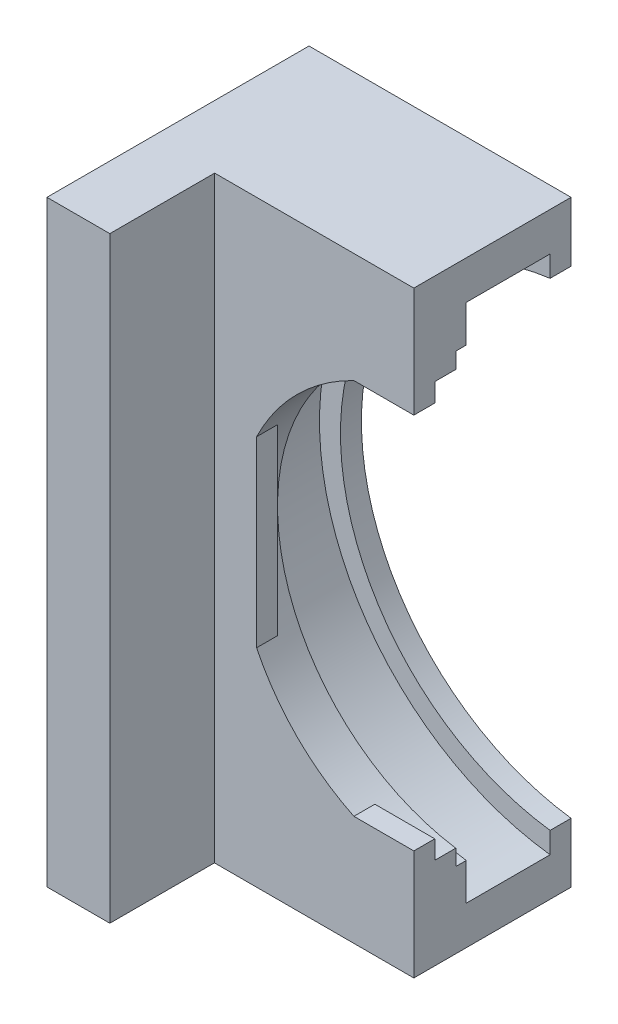
ISO-10303-21;
HEADER;
FILE_DESCRIPTION(('STEP AP214'),'2;1');
FILE_NAME('part.step','',(''),(''),'','','');
FILE_SCHEMA(('AUTOMOTIVE_DESIGN { 1 0 10303 214 1 1 1 1 }'));
ENDSEC;
DATA;
#1=APPLICATION_CONTEXT('core data for automotive mechanical design processes');
#2=APPLICATION_PROTOCOL_DEFINITION('international standard','automotive_design',2000,#1);
#3=PRODUCT_CONTEXT('',#1,'mechanical');
#4=PRODUCT('Part','Part','',(#3));
#5=PRODUCT_RELATED_PRODUCT_CATEGORY('part','',(#4));
#6=PRODUCT_DEFINITION_FORMATION('','',#4);
#7=PRODUCT_DEFINITION_CONTEXT('part definition',#1,'design');
#8=PRODUCT_DEFINITION('design','',#6,#7);
#9=PRODUCT_DEFINITION_SHAPE('','',#8);
#10=(LENGTH_UNIT() NAMED_UNIT(*) SI_UNIT(.MILLI.,.METRE.));
#11=(NAMED_UNIT(*) PLANE_ANGLE_UNIT() SI_UNIT($,.RADIAN.));
#12=(NAMED_UNIT(*) SI_UNIT($,.STERADIAN.) SOLID_ANGLE_UNIT());
#13=UNCERTAINTY_MEASURE_WITH_UNIT(LENGTH_MEASURE(1.E-05),#10,'distance_accuracy_value','');
#14=(GEOMETRIC_REPRESENTATION_CONTEXT(3) GLOBAL_UNCERTAINTY_ASSIGNED_CONTEXT((#13)) GLOBAL_UNIT_ASSIGNED_CONTEXT((#10,
#11,#12)) REPRESENTATION_CONTEXT('',''));
#15=CARTESIAN_POINT('',(0.,0.,0.));
#16=DIRECTION('',(0.,0.,1.));
#17=DIRECTION('',(1.,0.,0.));
#18=AXIS2_PLACEMENT_3D('',#15,#16,#17);
#19=CARTESIAN_POINT('',(-1.25,9.,7.5));
#20=DIRECTION('',(-1.,0.,0.));
#21=DIRECTION('',(0.,-1.,0.));
#22=AXIS2_PLACEMENT_3D('',#19,#20,#21);
#23=PLANE('',#22);
#24=DIRECTION('',(0.,0.,-1.));
#25=VECTOR('',#24,1.);
#26=CARTESIAN_POINT('',(-1.25,-4.35889894354067,7.5));
#27=LINE('',#26,#25);
#28=CARTESIAN_POINT('',(-1.25,-4.35889894354067,7.5));
#29=VERTEX_POINT('',#28);
#30=CARTESIAN_POINT('',(-1.25,-4.35889894354067,6.5));
#31=VERTEX_POINT('',#30);
#32=EDGE_CURVE('E192',#29,#31,#27,.T.);
#33=ORIENTED_EDGE('',*,*,#32,.T.);
#34=DIRECTION('',(0.,1.,0.));
#35=VECTOR('',#34,1.);
#36=CARTESIAN_POINT('',(-1.25,9.,6.5));
#37=LINE('',#36,#35);
#38=CARTESIAN_POINT('',(-1.25,4.35889894354068,6.5));
#39=VERTEX_POINT('',#38);
#40=EDGE_CURVE('E200',#31,#39,#37,.T.);
#41=ORIENTED_EDGE('',*,*,#40,.T.);
#42=DIRECTION('',(0.,0.,-1.));
#43=VECTOR('',#42,1.);
#44=CARTESIAN_POINT('',(-1.25,4.35889894354068,7.5));
#45=LINE('',#44,#43);
#46=CARTESIAN_POINT('',(-1.25,4.35889894354068,7.5));
#47=VERTEX_POINT('',#46);
#48=EDGE_CURVE('E194',#47,#39,#45,.T.);
#49=ORIENTED_EDGE('',*,*,#48,.F.);
#50=DIRECTION('',(0.,1.,0.));
#51=VECTOR('',#50,1.);
#52=CARTESIAN_POINT('',(-1.25,9.,7.5));
#53=LINE('',#52,#51);
#54=EDGE_CURVE('E58',#29,#47,#53,.T.);
#55=ORIENTED_EDGE('',*,*,#54,.F.);
#56=EDGE_LOOP('',(#33,#41,#49,#55));
#57=FACE_BOUND('',#56,.T.);
#58=ADVANCED_FACE('F43',(#57),#23,.F.);
#59=CARTESIAN_POINT('',(16.75,-9.,7.5));
#60=DIRECTION('',(0.,-1.,0.));
#61=DIRECTION('',(0.,0.,-1.));
#62=AXIS2_PLACEMENT_3D('',#59,#60,#61);
#63=PLANE('',#62);
#64=DIRECTION('',(0.,0.,-1.));
#65=VECTOR('',#64,1.);
#66=CARTESIAN_POINT('',(3.39110105645933,-9.,7.5));
#67=LINE('',#66,#65);
#68=CARTESIAN_POINT('',(3.39110105645933,-9.,7.5));
#69=VERTEX_POINT('',#68);
#70=CARTESIAN_POINT('',(3.39110105645933,-9.,6.5));
#71=VERTEX_POINT('',#70);
#72=EDGE_CURVE('E66',#69,#71,#67,.T.);
#73=ORIENTED_EDGE('',*,*,#72,.F.);
#74=DIRECTION('',(-1.,0.,0.));
#75=VECTOR('',#74,1.);
#76=CARTESIAN_POINT('',(16.75,-9.,7.5));
#77=LINE('',#76,#75);
#78=CARTESIAN_POINT('',(6.25,-9.,7.5));
#79=VERTEX_POINT('',#78);
#80=EDGE_CURVE('E218',#79,#69,#77,.T.);
#81=ORIENTED_EDGE('',*,*,#80,.F.);
#82=DIRECTION('',(0.,0.,1.));
#83=VECTOR('',#82,1.);
#84=CARTESIAN_POINT('',(6.25,-9.,7.5));
#85=LINE('',#84,#83);
#86=CARTESIAN_POINT('',(6.25,-9.,6.5));
#87=VERTEX_POINT('',#86);
#88=EDGE_CURVE('E225',#87,#79,#85,.T.);
#89=ORIENTED_EDGE('',*,*,#88,.F.);
#90=DIRECTION('',(-1.,0.,0.));
#91=VECTOR('',#90,1.);
#92=CARTESIAN_POINT('',(16.75,-9.,6.5));
#93=LINE('',#92,#91);
#94=EDGE_CURVE('E216',#87,#71,#93,.T.);
#95=ORIENTED_EDGE('',*,*,#94,.T.);
#96=EDGE_LOOP('',(#73,#81,#89,#95));
#97=FACE_BOUND('',#96,.T.);
#98=ADVANCED_FACE('F406',(#97),#63,.F.);
#99=CARTESIAN_POINT('',(16.75,9.,7.5));
#100=DIRECTION('',(0.,1.,0.));
#101=DIRECTION('',(0.,0.,1.));
#102=AXIS2_PLACEMENT_3D('',#99,#100,#101);
#103=PLANE('',#102);
#104=DIRECTION('',(0.,0.,-1.));
#105=VECTOR('',#104,1.);
#106=CARTESIAN_POINT('',(3.39110105645932,9.,7.5));
#107=LINE('',#106,#105);
#108=CARTESIAN_POINT('',(3.39110105645932,9.,7.5));
#109=VERTEX_POINT('',#108);
#110=CARTESIAN_POINT('',(3.39110105645932,9.,6.5));
#111=VERTEX_POINT('',#110);
#112=EDGE_CURVE('E203',#109,#111,#107,.T.);
#113=ORIENTED_EDGE('',*,*,#112,.T.);
#114=DIRECTION('',(1.,0.,0.));
#115=VECTOR('',#114,1.);
#116=CARTESIAN_POINT('',(16.75,9.,6.5));
#117=LINE('',#116,#115);
#118=CARTESIAN_POINT('',(6.25,9.,6.5));
#119=VERTEX_POINT('',#118);
#120=EDGE_CURVE('E202',#111,#119,#117,.T.);
#121=ORIENTED_EDGE('',*,*,#120,.T.);
#122=DIRECTION('',(0.,0.,-1.));
#123=VECTOR('',#122,1.);
#124=CARTESIAN_POINT('',(6.25,9.,7.5));
#125=LINE('',#124,#123);
#126=CARTESIAN_POINT('',(6.25,9.,7.5));
#127=VERTEX_POINT('',#126);
#128=EDGE_CURVE('E219',#127,#119,#125,.T.);
#129=ORIENTED_EDGE('',*,*,#128,.F.);
#130=DIRECTION('',(1.,0.,0.));
#131=VECTOR('',#130,1.);
#132=CARTESIAN_POINT('',(16.75,9.,7.5));
#133=LINE('',#132,#131);
#134=EDGE_CURVE('E215',#109,#127,#133,.T.);
#135=ORIENTED_EDGE('',*,*,#134,.F.);
#136=EDGE_LOOP('',(#113,#121,#129,#135));
#137=FACE_BOUND('',#136,.T.);
#138=ADVANCED_FACE('F389',(#137),#103,.F.);
#139=CARTESIAN_POINT('',(6.25,14.25,7.5));
#140=DIRECTION('',(-1.,0.,0.));
#141=DIRECTION('',(0.,-1.,0.));
#142=AXIS2_PLACEMENT_3D('',#139,#140,#141);
#143=PLANE('',#142);
#144=DIRECTION('',(0.,-1.,0.));
#145=VECTOR('',#144,1.);
#146=CARTESIAN_POINT('',(6.25,14.25,6.5));
#147=LINE('',#146,#145);
#148=CARTESIAN_POINT('',(6.25,-9.88685996664259,6.5));
#149=VERTEX_POINT('',#148);
#150=EDGE_CURVE('E51',#87,#149,#147,.T.);
#151=ORIENTED_EDGE('',*,*,#150,.F.);
#152=ORIENTED_EDGE('',*,*,#88,.T.);
#153=DIRECTION('',(0.,1.,0.));
#154=VECTOR('',#153,1.);
#155=CARTESIAN_POINT('',(6.25,14.25,7.5));
#156=LINE('',#155,#154);
#157=CARTESIAN_POINT('',(6.25,-14.25,7.5));
#158=VERTEX_POINT('',#157);
#159=EDGE_CURVE('E288',#158,#79,#156,.T.);
#160=ORIENTED_EDGE('',*,*,#159,.F.);
#161=DIRECTION('',(0.,0.,-1.));
#162=VECTOR('',#161,1.);
#163=CARTESIAN_POINT('',(6.25,-14.25,7.5));
#164=LINE('',#163,#162);
#165=CARTESIAN_POINT('',(6.25,-14.25,0.));
#166=VERTEX_POINT('',#165);
#167=EDGE_CURVE('E298',#158,#166,#164,.T.);
#168=ORIENTED_EDGE('',*,*,#167,.T.);
#169=DIRECTION('',(0.,1.,0.));
#170=VECTOR('',#169,1.);
#171=CARTESIAN_POINT('',(6.25,14.25,0.));
#172=LINE('',#171,#170);
#173=CARTESIAN_POINT('',(6.25,-11.4017542509914,0.));
#174=VERTEX_POINT('',#173);
#175=EDGE_CURVE('E299',#166,#174,#172,.T.);
#176=ORIENTED_EDGE('',*,*,#175,.T.);
#177=DIRECTION('',(0.,0.,-1.));
#178=VECTOR('',#177,1.);
#179=CARTESIAN_POINT('',(6.25,-11.4017542509914,1.));
#180=LINE('',#179,#178);
#181=CARTESIAN_POINT('',(6.25,-11.4017542509914,1.));
#182=VERTEX_POINT('',#181);
#183=EDGE_CURVE('E256',#174,#182,#180,.F.);
#184=ORIENTED_EDGE('',*,*,#183,.T.);
#185=DIRECTION('',(0.,-1.,0.));
#186=VECTOR('',#185,1.);
#187=CARTESIAN_POINT('',(6.25,14.25,1.));
#188=LINE('',#187,#186);
#189=CARTESIAN_POINT('',(6.25,-12.4096736459909,1.));
#190=VERTEX_POINT('',#189);
#191=EDGE_CURVE('E248',#182,#190,#188,.T.);
#192=ORIENTED_EDGE('',*,*,#191,.T.);
#193=DIRECTION('',(0.,0.,-1.));
#194=VECTOR('',#193,1.);
#195=CARTESIAN_POINT('',(6.25,-12.4096736459909,5.));
#196=LINE('',#195,#194);
#197=CARTESIAN_POINT('',(6.25,-12.4096736459909,5.));
#198=VERTEX_POINT('',#197);
#199=EDGE_CURVE('E322',#190,#198,#196,.F.);
#200=ORIENTED_EDGE('',*,*,#199,.T.);
#201=DIRECTION('',(0.,-1.,0.));
#202=VECTOR('',#201,1.);
#203=CARTESIAN_POINT('',(6.25,14.25,5.));
#204=LINE('',#203,#202);
#205=CARTESIAN_POINT('',(6.25,-10.6448344280219,5.));
#206=VERTEX_POINT('',#205);
#207=EDGE_CURVE('E325',#206,#198,#204,.T.);
#208=ORIENTED_EDGE('',*,*,#207,.F.);
#209=DIRECTION('',(0.,0.,-1.));
#210=VECTOR('',#209,1.);
#211=CARTESIAN_POINT('',(6.25,-10.6448344280219,5.5));
#212=LINE('',#211,#210);
#213=CARTESIAN_POINT('',(6.25,-10.6448344280219,5.5));
#214=VERTEX_POINT('',#213);
#215=EDGE_CURVE('E238',#206,#214,#212,.F.);
#216=ORIENTED_EDGE('',*,*,#215,.T.);
#217=DIRECTION('',(0.,-1.,0.));
#218=VECTOR('',#217,1.);
#219=CARTESIAN_POINT('',(6.25,14.25,5.5));
#220=LINE('',#219,#218);
#221=CARTESIAN_POINT('',(6.25,-9.88685996664259,5.5));
#222=VERTEX_POINT('',#221);
#223=EDGE_CURVE('E334',#222,#214,#220,.T.);
#224=ORIENTED_EDGE('',*,*,#223,.F.);
#225=DIRECTION('',(0.,0.,-1.));
#226=VECTOR('',#225,1.);
#227=CARTESIAN_POINT('',(6.25,-9.88685996664259,6.5));
#228=LINE('',#227,#226);
#229=EDGE_CURVE('E229',#222,#149,#228,.F.);
#230=ORIENTED_EDGE('',*,*,#229,.T.);
#231=EDGE_LOOP('',(#151,#152,#160,#168,#176,#184,#192,#200,#208,#216,#224,#230));
#232=FACE_BOUND('',#231,.T.);
#233=ADVANCED_FACE('F346',(#232),#143,.F.);
#234=CARTESIAN_POINT('',(7.75,0.,6.5));
#235=DIRECTION('',(0.,0.,-1.));
#236=DIRECTION('',(-1.,0.,0.));
#237=AXIS2_PLACEMENT_3D('',#234,#235,#236);
#238=PLANE('',#237);
#239=ORIENTED_EDGE('',*,*,#40,.F.);
#240=CARTESIAN_POINT('',(7.75,0.,6.5));
#241=DIRECTION('',(0.,0.,-1.));
#242=DIRECTION('',(-1.,0.,0.));
#243=AXIS2_PLACEMENT_3D('',#240,#241,#242);
#244=CIRCLE('',#243,10.);
#245=EDGE_CURVE('E187',#31,#39,#244,.T.);
#246=ORIENTED_EDGE('',*,*,#245,.T.);
#247=EDGE_LOOP('',(#239,#246));
#248=FACE_BOUND('',#247,.T.);
#249=ADVANCED_FACE('F201',(#248),#238,.T.);
#250=ORIENTED_EDGE('',*,*,#94,.F.);
#251=ORIENTED_EDGE('',*,*,#150,.T.);
#252=EDGE_CURVE('E197',#149,#71,#244,.T.);
#253=ORIENTED_EDGE('',*,*,#252,.T.);
#254=EDGE_LOOP('',(#250,#251,#253));
#255=FACE_BOUND('',#254,.T.);
#256=ADVANCED_FACE('F343',(#255),#238,.T.);
#257=CARTESIAN_POINT('',(6.25,14.25,7.5));
#258=VERTEX_POINT('',#257);
#259=EDGE_CURVE('E292',#127,#258,#156,.T.);
#260=ORIENTED_EDGE('',*,*,#259,.F.);
#261=ORIENTED_EDGE('',*,*,#128,.T.);
#262=CARTESIAN_POINT('',(6.25,9.88685996664259,6.5));
#263=VERTEX_POINT('',#262);
#264=EDGE_CURVE('E11',#263,#119,#147,.T.);
#265=ORIENTED_EDGE('',*,*,#264,.F.);
#266=DIRECTION('',(0.,0.,-1.));
#267=VECTOR('',#266,1.);
#268=CARTESIAN_POINT('',(6.25,9.88685996664259,6.5));
#269=LINE('',#268,#267);
#270=CARTESIAN_POINT('',(6.25,9.88685996664259,5.5));
#271=VERTEX_POINT('',#270);
#272=EDGE_CURVE('E232',#263,#271,#269,.T.);
#273=ORIENTED_EDGE('',*,*,#272,.T.);
#274=CARTESIAN_POINT('',(6.25,10.6448344280219,5.5));
#275=VERTEX_POINT('',#274);
#276=EDGE_CURVE('E335',#275,#271,#220,.T.);
#277=ORIENTED_EDGE('',*,*,#276,.F.);
#278=DIRECTION('',(0.,0.,-1.));
#279=VECTOR('',#278,1.);
#280=CARTESIAN_POINT('',(6.25,10.6448344280219,5.5));
#281=LINE('',#280,#279);
#282=CARTESIAN_POINT('',(6.25,10.6448344280219,5.));
#283=VERTEX_POINT('',#282);
#284=EDGE_CURVE('E241',#275,#283,#281,.T.);
#285=ORIENTED_EDGE('',*,*,#284,.T.);
#286=CARTESIAN_POINT('',(6.25,12.4096736459909,5.));
#287=VERTEX_POINT('',#286);
#288=EDGE_CURVE('E326',#287,#283,#204,.T.);
#289=ORIENTED_EDGE('',*,*,#288,.F.);
#290=DIRECTION('',(0.,0.,-1.));
#291=VECTOR('',#290,1.);
#292=CARTESIAN_POINT('',(6.25,12.4096736459909,5.));
#293=LINE('',#292,#291);
#294=CARTESIAN_POINT('',(6.25,12.4096736459909,1.));
#295=VERTEX_POINT('',#294);
#296=EDGE_CURVE('E329',#287,#295,#293,.T.);
#297=ORIENTED_EDGE('',*,*,#296,.T.);
#298=CARTESIAN_POINT('',(6.25,11.4017542509914,1.));
#299=VERTEX_POINT('',#298);
#300=EDGE_CURVE('E253',#295,#299,#188,.T.);
#301=ORIENTED_EDGE('',*,*,#300,.T.);
#302=DIRECTION('',(0.,0.,-1.));
#303=VECTOR('',#302,1.);
#304=CARTESIAN_POINT('',(6.25,11.4017542509914,1.));
#305=LINE('',#304,#303);
#306=CARTESIAN_POINT('',(6.25,11.4017542509914,0.));
#307=VERTEX_POINT('',#306);
#308=EDGE_CURVE('E259',#299,#307,#305,.T.);
#309=ORIENTED_EDGE('',*,*,#308,.T.);
#310=CARTESIAN_POINT('',(6.25,14.25,0.));
#311=VERTEX_POINT('',#310);
#312=EDGE_CURVE('E287',#307,#311,#172,.T.);
#313=ORIENTED_EDGE('',*,*,#312,.T.);
#314=DIRECTION('',(0.,0.,-1.));
#315=VECTOR('',#314,1.);
#316=CARTESIAN_POINT('',(6.25,14.25,7.5));
#317=LINE('',#316,#315);
#318=EDGE_CURVE('E316',#258,#311,#317,.T.);
#319=ORIENTED_EDGE('',*,*,#318,.F.);
#320=EDGE_LOOP('',(#260,#261,#265,#273,#277,#285,#289,#297,#301,#309,#313,#319));
#321=FACE_BOUND('',#320,.T.);
#322=ADVANCED_FACE('F45',(#321),#143,.F.);
#323=CARTESIAN_POINT('',(-6.25,14.25,7.5));
#324=DIRECTION('',(0.,-1.,0.));
#325=DIRECTION('',(0.,0.,-1.));
#326=AXIS2_PLACEMENT_3D('',#323,#324,#325);
#327=PLANE('',#326);
#328=DIRECTION('',(-1.,0.,0.));
#329=VECTOR('',#328,1.);
#330=CARTESIAN_POINT('',(-6.25,14.25,0.));
#331=LINE('',#330,#329);
#332=CARTESIAN_POINT('',(-6.25,14.25,0.));
#333=VERTEX_POINT('',#332);
#334=EDGE_CURVE('E302',#311,#333,#331,.T.);
#335=ORIENTED_EDGE('',*,*,#334,.T.);
#336=DIRECTION('',(0.,0.,-1.));
#337=VECTOR('',#336,1.);
#338=CARTESIAN_POINT('',(-6.25,14.25,7.5));
#339=LINE('',#338,#337);
#340=CARTESIAN_POINT('',(-6.25,14.25,12.5));
#341=VERTEX_POINT('',#340);
#342=EDGE_CURVE('E313',#341,#333,#339,.T.);
#343=ORIENTED_EDGE('',*,*,#342,.F.);
#344=DIRECTION('',(-1.,0.,0.));
#345=VECTOR('',#344,1.);
#346=CARTESIAN_POINT('',(-6.25,14.25,12.5));
#347=LINE('',#346,#345);
#348=CARTESIAN_POINT('',(-3.25,14.25,12.5));
#349=VERTEX_POINT('',#348);
#350=EDGE_CURVE('E271',#349,#341,#347,.T.);
#351=ORIENTED_EDGE('',*,*,#350,.F.);
#352=DIRECTION('',(0.,0.,-1.));
#353=VECTOR('',#352,1.);
#354=CARTESIAN_POINT('',(-3.25,14.25,12.5));
#355=LINE('',#354,#353);
#356=CARTESIAN_POINT('',(-3.25,14.25,7.5));
#357=VERTEX_POINT('',#356);
#358=EDGE_CURVE('E274',#349,#357,#355,.T.);
#359=ORIENTED_EDGE('',*,*,#358,.T.);
#360=DIRECTION('',(-1.,0.,0.));
#361=VECTOR('',#360,1.);
#362=CARTESIAN_POINT('',(-6.25,14.25,7.5));
#363=LINE('',#362,#361);
#364=EDGE_CURVE('E291',#258,#357,#363,.T.);
#365=ORIENTED_EDGE('',*,*,#364,.F.);
#366=ORIENTED_EDGE('',*,*,#318,.T.);
#367=EDGE_LOOP('',(#335,#343,#351,#359,#365,#366));
#368=FACE_BOUND('',#367,.T.);
#369=ADVANCED_FACE('F381',(#368),#327,.F.);
#370=CARTESIAN_POINT('',(-6.25,14.25,7.5));
#371=DIRECTION('',(1.,0.,0.));
#372=DIRECTION('',(0.,1.,0.));
#373=AXIS2_PLACEMENT_3D('',#370,#371,#372);
#374=PLANE('',#373);
#375=DIRECTION('',(0.,-1.,0.));
#376=VECTOR('',#375,1.);
#377=CARTESIAN_POINT('',(-6.25,14.25,0.));
#378=LINE('',#377,#376);
#379=CARTESIAN_POINT('',(-6.25,-14.25,0.));
#380=VERTEX_POINT('',#379);
#381=EDGE_CURVE('E304',#333,#380,#378,.T.);
#382=ORIENTED_EDGE('',*,*,#381,.T.);
#383=DIRECTION('',(0.,0.,-1.));
#384=VECTOR('',#383,1.);
#385=CARTESIAN_POINT('',(-6.25,-14.25,7.5));
#386=LINE('',#385,#384);
#387=CARTESIAN_POINT('',(-6.25,-14.25,7.5));
#388=VERTEX_POINT('',#387);
#389=EDGE_CURVE('E310',#388,#380,#386,.T.);
#390=ORIENTED_EDGE('',*,*,#389,.F.);
#391=DIRECTION('',(0.,-1.,0.));
#392=VECTOR('',#391,1.);
#393=CARTESIAN_POINT('',(-6.25,14.25,7.5));
#394=LINE('',#393,#392);
#395=CARTESIAN_POINT('',(-6.25,-14.238787574941,7.5));
#396=VERTEX_POINT('',#395);
#397=EDGE_CURVE('E294',#396,#388,#394,.T.);
#398=ORIENTED_EDGE('',*,*,#397,.F.);
#399=DIRECTION('',(0.,0.,-1.));
#400=VECTOR('',#399,1.);
#401=CARTESIAN_POINT('',(-6.25,-14.238787574941,12.5));
#402=LINE('',#401,#400);
#403=CARTESIAN_POINT('',(-6.25,-14.238787574941,12.5));
#404=VERTEX_POINT('',#403);
#405=EDGE_CURVE('E284',#404,#396,#402,.T.);
#406=ORIENTED_EDGE('',*,*,#405,.F.);
#407=DIRECTION('',(0.,-1.,0.));
#408=VECTOR('',#407,1.);
#409=CARTESIAN_POINT('',(-6.25,14.25,12.5));
#410=LINE('',#409,#408);
#411=EDGE_CURVE('E263',#341,#404,#410,.T.);
#412=ORIENTED_EDGE('',*,*,#411,.F.);
#413=ORIENTED_EDGE('',*,*,#342,.T.);
#414=EDGE_LOOP('',(#382,#390,#398,#406,#412,#413));
#415=FACE_BOUND('',#414,.T.);
#416=ADVANCED_FACE('F422',(#415),#374,.F.);
#417=CARTESIAN_POINT('',(-6.25,-14.25,7.5));
#418=DIRECTION('',(0.,1.,0.));
#419=DIRECTION('',(0.,0.,1.));
#420=AXIS2_PLACEMENT_3D('',#417,#418,#419);
#421=PLANE('',#420);
#422=DIRECTION('',(1.,0.,0.));
#423=VECTOR('',#422,1.);
#424=CARTESIAN_POINT('',(-6.25,-14.25,0.));
#425=LINE('',#424,#423);
#426=EDGE_CURVE('E306',#380,#166,#425,.T.);
#427=ORIENTED_EDGE('',*,*,#426,.T.);
#428=ORIENTED_EDGE('',*,*,#167,.F.);
#429=DIRECTION('',(1.,0.,0.));
#430=VECTOR('',#429,1.);
#431=CARTESIAN_POINT('',(-6.25,-14.25,7.5));
#432=LINE('',#431,#430);
#433=EDGE_CURVE('E296',#388,#158,#432,.T.);
#434=ORIENTED_EDGE('',*,*,#433,.F.);
#435=ORIENTED_EDGE('',*,*,#389,.T.);
#436=EDGE_LOOP('',(#427,#428,#434,#435));
#437=FACE_BOUND('',#436,.T.);
#438=ADVANCED_FACE('F426',(#437),#421,.F.);
#439=CARTESIAN_POINT('',(0.,0.,7.5));
#440=DIRECTION('',(0.,0.,1.));
#441=DIRECTION('',(1.,0.,0.));
#442=AXIS2_PLACEMENT_3D('',#439,#440,#441);
#443=PLANE('',#442);
#444=CARTESIAN_POINT('',(7.75,0.,7.5));
#445=DIRECTION('',(0.,0.,-1.));
#446=DIRECTION('',(1.,0.,0.));
#447=AXIS2_PLACEMENT_3D('',#444,#445,#446);
#448=CIRCLE('',#447,10.);
#449=EDGE_CURVE('E206',#69,#29,#448,.T.);
#450=ORIENTED_EDGE('',*,*,#449,.T.);
#451=ORIENTED_EDGE('',*,*,#54,.T.);
#452=CARTESIAN_POINT('',(7.75,0.,7.5));
#453=DIRECTION('',(0.,0.,-1.));
#454=DIRECTION('',(1.,0.,0.));
#455=AXIS2_PLACEMENT_3D('',#452,#453,#454);
#456=CIRCLE('',#455,10.);
#457=EDGE_CURVE('E210',#47,#109,#456,.T.);
#458=ORIENTED_EDGE('',*,*,#457,.T.);
#459=ORIENTED_EDGE('',*,*,#134,.T.);
#460=ORIENTED_EDGE('',*,*,#259,.T.);
#461=ORIENTED_EDGE('',*,*,#364,.T.);
#462=DIRECTION('',(0.,1.,0.));
#463=VECTOR('',#462,1.);
#464=CARTESIAN_POINT('',(-3.25,14.25,7.5));
#465=LINE('',#464,#463);
#466=CARTESIAN_POINT('',(-3.25,-14.238787574941,7.5));
#467=VERTEX_POINT('',#466);
#468=EDGE_CURVE('E267',#467,#357,#465,.T.);
#469=ORIENTED_EDGE('',*,*,#468,.F.);
#470=DIRECTION('',(1.,0.,0.));
#471=VECTOR('',#470,1.);
#472=CARTESIAN_POINT('',(-6.25,-14.238787574941,7.5));
#473=LINE('',#472,#471);
#474=EDGE_CURVE('E262',#396,#467,#473,.T.);
#475=ORIENTED_EDGE('',*,*,#474,.F.);
#476=ORIENTED_EDGE('',*,*,#397,.T.);
#477=ORIENTED_EDGE('',*,*,#433,.T.);
#478=ORIENTED_EDGE('',*,*,#159,.T.);
#479=ORIENTED_EDGE('',*,*,#80,.T.);
#480=EDGE_LOOP('',(#450,#451,#458,#459,#460,#461,#469,#475,#476,#477,#478,#479));
#481=FACE_BOUND('',#480,.T.);
#482=ADVANCED_FACE('F385',(#481),#443,.T.);
#483=CARTESIAN_POINT('',(0.,0.,0.));
#484=DIRECTION('',(0.,0.,1.));
#485=DIRECTION('',(1.,0.,0.));
#486=AXIS2_PLACEMENT_3D('',#483,#484,#485);
#487=PLANE('',#486);
#488=ORIENTED_EDGE('',*,*,#312,.F.);
#489=CARTESIAN_POINT('',(7.75,0.,0.));
#490=DIRECTION('',(0.,0.,1.));
#491=DIRECTION('',(1.,0.,0.));
#492=AXIS2_PLACEMENT_3D('',#489,#490,#491);
#493=CIRCLE('',#492,11.5);
#494=EDGE_CURVE('E319',#307,#174,#493,.T.);
#495=ORIENTED_EDGE('',*,*,#494,.T.);
#496=ORIENTED_EDGE('',*,*,#175,.F.);
#497=ORIENTED_EDGE('',*,*,#426,.F.);
#498=ORIENTED_EDGE('',*,*,#381,.F.);
#499=ORIENTED_EDGE('',*,*,#334,.F.);
#500=EDGE_LOOP('',(#488,#495,#496,#497,#498,#499));
#501=FACE_BOUND('',#500,.T.);
#502=ADVANCED_FACE('F375',(#501),#487,.F.);
#503=CARTESIAN_POINT('',(-6.25,-14.238787574941,12.5));
#504=DIRECTION('',(0.,1.,0.));
#505=DIRECTION('',(0.,0.,1.));
#506=AXIS2_PLACEMENT_3D('',#503,#504,#505);
#507=PLANE('',#506);
#508=ORIENTED_EDGE('',*,*,#474,.T.);
#509=DIRECTION('',(0.,0.,-1.));
#510=VECTOR('',#509,1.);
#511=CARTESIAN_POINT('',(-3.25,-14.238787574941,12.5));
#512=LINE('',#511,#510);
#513=CARTESIAN_POINT('',(-3.25,-14.238787574941,12.5));
#514=VERTEX_POINT('',#513);
#515=EDGE_CURVE('E281',#514,#467,#512,.T.);
#516=ORIENTED_EDGE('',*,*,#515,.F.);
#517=DIRECTION('',(1.,0.,0.));
#518=VECTOR('',#517,1.);
#519=CARTESIAN_POINT('',(-6.25,-14.238787574941,12.5));
#520=LINE('',#519,#518);
#521=EDGE_CURVE('E266',#404,#514,#520,.T.);
#522=ORIENTED_EDGE('',*,*,#521,.F.);
#523=ORIENTED_EDGE('',*,*,#405,.T.);
#524=EDGE_LOOP('',(#508,#516,#522,#523));
#525=FACE_BOUND('',#524,.T.);
#526=ADVANCED_FACE('F435',(#525),#507,.F.);
#527=CARTESIAN_POINT('',(-3.25,14.25,12.5));
#528=DIRECTION('',(-1.,0.,0.));
#529=DIRECTION('',(0.,-1.,0.));
#530=AXIS2_PLACEMENT_3D('',#527,#528,#529);
#531=PLANE('',#530);
#532=ORIENTED_EDGE('',*,*,#468,.T.);
#533=ORIENTED_EDGE('',*,*,#358,.F.);
#534=DIRECTION('',(0.,1.,0.));
#535=VECTOR('',#534,1.);
#536=CARTESIAN_POINT('',(-3.25,14.25,12.5));
#537=LINE('',#536,#535);
#538=EDGE_CURVE('E269',#514,#349,#537,.T.);
#539=ORIENTED_EDGE('',*,*,#538,.F.);
#540=ORIENTED_EDGE('',*,*,#515,.T.);
#541=EDGE_LOOP('',(#532,#533,#539,#540));
#542=FACE_BOUND('',#541,.T.);
#543=ADVANCED_FACE('F440',(#542),#531,.F.);
#544=CARTESIAN_POINT('',(0.,0.,12.5));
#545=DIRECTION('',(0.,0.,1.));
#546=DIRECTION('',(1.,0.,0.));
#547=AXIS2_PLACEMENT_3D('',#544,#545,#546);
#548=PLANE('',#547);
#549=ORIENTED_EDGE('',*,*,#411,.T.);
#550=ORIENTED_EDGE('',*,*,#521,.T.);
#551=ORIENTED_EDGE('',*,*,#538,.T.);
#552=ORIENTED_EDGE('',*,*,#350,.T.);
#553=EDGE_LOOP('',(#549,#550,#551,#552));
#554=FACE_BOUND('',#553,.T.);
#555=ADVANCED_FACE('F444',(#554),#548,.T.);
#556=CARTESIAN_POINT('',(7.75,0.,1.));
#557=DIRECTION('',(0.,0.,-1.));
#558=DIRECTION('',(-1.,0.,0.));
#559=AXIS2_PLACEMENT_3D('',#556,#557,#558);
#560=CYLINDRICAL_SURFACE('',#559,11.5);
#561=CARTESIAN_POINT('',(7.75,0.,1.));
#562=DIRECTION('',(0.,0.,-1.));
#563=DIRECTION('',(-1.,0.,0.));
#564=AXIS2_PLACEMENT_3D('',#561,#562,#563);
#565=CIRCLE('',#564,11.5);
#566=EDGE_CURVE('E254',#182,#299,#565,.T.);
#567=ORIENTED_EDGE('',*,*,#566,.F.);
#568=ORIENTED_EDGE('',*,*,#183,.F.);
#569=ORIENTED_EDGE('',*,*,#494,.F.);
#570=ORIENTED_EDGE('',*,*,#308,.F.);
#571=EDGE_LOOP('',(#567,#568,#569,#570));
#572=FACE_BOUND('',#571,.T.);
#573=ADVANCED_FACE('F370',(#572),#560,.F.);
#574=CARTESIAN_POINT('',(7.75,0.,5.));
#575=DIRECTION('',(0.,0.,-1.));
#576=DIRECTION('',(-1.,0.,0.));
#577=AXIS2_PLACEMENT_3D('',#574,#575,#576);
#578=CYLINDRICAL_SURFACE('',#577,12.5);
#579=CARTESIAN_POINT('',(7.75,0.,5.));
#580=DIRECTION('',(0.,0.,-1.));
#581=DIRECTION('',(-1.,0.,0.));
#582=AXIS2_PLACEMENT_3D('',#579,#580,#581);
#583=CIRCLE('',#582,12.5);
#584=EDGE_CURVE('E245',#198,#287,#583,.T.);
#585=ORIENTED_EDGE('',*,*,#584,.F.);
#586=ORIENTED_EDGE('',*,*,#199,.F.);
#587=CARTESIAN_POINT('',(7.75,0.,1.));
#588=DIRECTION('',(0.,0.,-1.));
#589=DIRECTION('',(-1.,0.,0.));
#590=AXIS2_PLACEMENT_3D('',#587,#588,#589);
#591=CIRCLE('',#590,12.5);
#592=EDGE_CURVE('E244',#190,#295,#591,.T.);
#593=ORIENTED_EDGE('',*,*,#592,.T.);
#594=ORIENTED_EDGE('',*,*,#296,.F.);
#595=EDGE_LOOP('',(#585,#586,#593,#594));
#596=FACE_BOUND('',#595,.T.);
#597=ADVANCED_FACE('F362',(#596),#578,.F.);
#598=CARTESIAN_POINT('',(7.75,0.,5.));
#599=DIRECTION('',(0.,0.,-1.));
#600=DIRECTION('',(-1.,0.,0.));
#601=AXIS2_PLACEMENT_3D('',#598,#599,#600);
#602=PLANE('',#601);
#603=CARTESIAN_POINT('',(7.75,0.,5.));
#604=DIRECTION('',(0.,0.,-1.));
#605=DIRECTION('',(-1.,0.,0.));
#606=AXIS2_PLACEMENT_3D('',#603,#604,#605);
#607=CIRCLE('',#606,10.75);
#608=EDGE_CURVE('E332',#206,#283,#607,.T.);
#609=ORIENTED_EDGE('',*,*,#608,.F.);
#610=ORIENTED_EDGE('',*,*,#207,.T.);
#611=ORIENTED_EDGE('',*,*,#584,.T.);
#612=ORIENTED_EDGE('',*,*,#288,.T.);
#613=EDGE_LOOP('',(#609,#610,#611,#612));
#614=FACE_BOUND('',#613,.T.);
#615=ADVANCED_FACE('F359',(#614),#602,.T.);
#616=CARTESIAN_POINT('',(7.75,0.,1.));
#617=DIRECTION('',(0.,0.,-1.));
#618=DIRECTION('',(-1.,0.,0.));
#619=AXIS2_PLACEMENT_3D('',#616,#617,#618);
#620=PLANE('',#619);
#621=ORIENTED_EDGE('',*,*,#592,.F.);
#622=ORIENTED_EDGE('',*,*,#191,.F.);
#623=ORIENTED_EDGE('',*,*,#566,.T.);
#624=ORIENTED_EDGE('',*,*,#300,.F.);
#625=EDGE_LOOP('',(#621,#622,#623,#624));
#626=FACE_BOUND('',#625,.T.);
#627=ADVANCED_FACE('F366',(#626),#620,.F.);
#628=CARTESIAN_POINT('',(7.75,0.,5.5));
#629=DIRECTION('',(0.,0.,-1.));
#630=DIRECTION('',(-1.,0.,0.));
#631=AXIS2_PLACEMENT_3D('',#628,#629,#630);
#632=PLANE('',#631);
#633=CARTESIAN_POINT('',(7.75,0.,5.5));
#634=DIRECTION('',(0.,0.,-1.));
#635=DIRECTION('',(-1.,0.,0.));
#636=AXIS2_PLACEMENT_3D('',#633,#634,#635);
#637=CIRCLE('',#636,10.);
#638=EDGE_CURVE('E337',#222,#271,#637,.T.);
#639=ORIENTED_EDGE('',*,*,#638,.F.);
#640=ORIENTED_EDGE('',*,*,#223,.T.);
#641=CARTESIAN_POINT('',(7.75,0.,5.5));
#642=DIRECTION('',(0.,0.,-1.));
#643=DIRECTION('',(-1.,0.,0.));
#644=AXIS2_PLACEMENT_3D('',#641,#642,#643);
#645=CIRCLE('',#644,10.75);
#646=EDGE_CURVE('E235',#214,#275,#645,.T.);
#647=ORIENTED_EDGE('',*,*,#646,.T.);
#648=ORIENTED_EDGE('',*,*,#276,.T.);
#649=EDGE_LOOP('',(#639,#640,#647,#648));
#650=FACE_BOUND('',#649,.T.);
#651=ADVANCED_FACE('F350',(#650),#632,.T.);
#652=CARTESIAN_POINT('',(7.75,0.,5.5));
#653=DIRECTION('',(0.,0.,-1.));
#654=DIRECTION('',(-1.,0.,0.));
#655=AXIS2_PLACEMENT_3D('',#652,#653,#654);
#656=CYLINDRICAL_SURFACE('',#655,10.75);
#657=ORIENTED_EDGE('',*,*,#646,.F.);
#658=ORIENTED_EDGE('',*,*,#215,.F.);
#659=ORIENTED_EDGE('',*,*,#608,.T.);
#660=ORIENTED_EDGE('',*,*,#284,.F.);
#661=EDGE_LOOP('',(#657,#658,#659,#660));
#662=FACE_BOUND('',#661,.T.);
#663=ADVANCED_FACE('F353',(#662),#656,.F.);
#664=ORIENTED_EDGE('',*,*,#120,.F.);
#665=EDGE_CURVE('E198',#111,#263,#244,.T.);
#666=ORIENTED_EDGE('',*,*,#665,.T.);
#667=ORIENTED_EDGE('',*,*,#264,.T.);
#668=EDGE_LOOP('',(#664,#666,#667));
#669=FACE_BOUND('',#668,.T.);
#670=ADVANCED_FACE('F393',(#669),#238,.T.);
#671=CARTESIAN_POINT('',(7.75,0.,6.5));
#672=DIRECTION('',(0.,0.,-1.));
#673=DIRECTION('',(-1.,0.,0.));
#674=AXIS2_PLACEMENT_3D('',#671,#672,#673);
#675=CYLINDRICAL_SURFACE('',#674,10.);
#676=ORIENTED_EDGE('',*,*,#252,.F.);
#677=ORIENTED_EDGE('',*,*,#229,.F.);
#678=ORIENTED_EDGE('',*,*,#638,.T.);
#679=ORIENTED_EDGE('',*,*,#272,.F.);
#680=ORIENTED_EDGE('',*,*,#665,.F.);
#681=ORIENTED_EDGE('',*,*,#112,.F.);
#682=ORIENTED_EDGE('',*,*,#457,.F.);
#683=ORIENTED_EDGE('',*,*,#48,.T.);
#684=ORIENTED_EDGE('',*,*,#245,.F.);
#685=ORIENTED_EDGE('',*,*,#32,.F.);
#686=ORIENTED_EDGE('',*,*,#449,.F.);
#687=ORIENTED_EDGE('',*,*,#72,.T.);
#688=EDGE_LOOP('',(#676,#677,#678,#679,#680,#681,#682,#683,#684,#685,#686,#687));
#689=FACE_BOUND('',#688,.T.);
#690=ADVANCED_FACE('F190',(#689),#675,.F.);
#691=CLOSED_SHELL('',(#58,#98,#138,#233,#249,#256,#322,#369,#416,#438,#482,#502,#526,#543,#555,
#573,#597,#615,#627,#651,#663,#670,#690));
#692=MANIFOLD_SOLID_BREP('B2',#691);
#693=ADVANCED_BREP_SHAPE_REPRESENTATION('',(#18,#692),#14);
#694=SHAPE_DEFINITION_REPRESENTATION(#9,#693);
ENDSEC;
END-ISO-10303-21;
